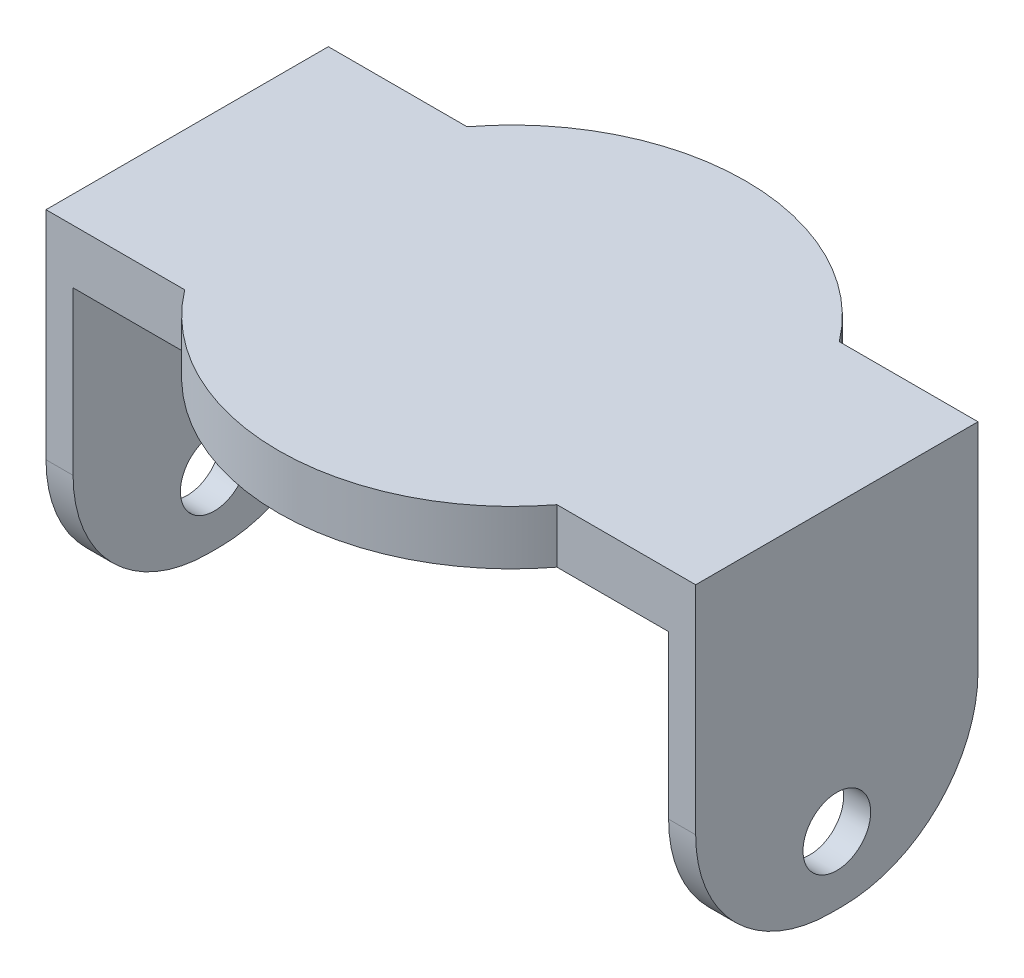
ISO-10303-21;
HEADER;
FILE_DESCRIPTION(('STEP AP214'),'2;1');
FILE_NAME('part.step','',(''),(''),'','','');
FILE_SCHEMA(('AUTOMOTIVE_DESIGN { 1 0 10303 214 1 1 1 1 }'));
ENDSEC;
DATA;
#1=APPLICATION_CONTEXT('core data for automotive mechanical design processes');
#2=APPLICATION_PROTOCOL_DEFINITION('international standard','automotive_design',2000,#1);
#3=PRODUCT_CONTEXT('',#1,'mechanical');
#4=PRODUCT('Part','Part','',(#3));
#5=PRODUCT_RELATED_PRODUCT_CATEGORY('part','',(#4));
#6=PRODUCT_DEFINITION_FORMATION('','',#4);
#7=PRODUCT_DEFINITION_CONTEXT('part definition',#1,'design');
#8=PRODUCT_DEFINITION('design','',#6,#7);
#9=PRODUCT_DEFINITION_SHAPE('','',#8);
#10=(LENGTH_UNIT() NAMED_UNIT(*) SI_UNIT(.MILLI.,.METRE.));
#11=(NAMED_UNIT(*) PLANE_ANGLE_UNIT() SI_UNIT($,.RADIAN.));
#12=(NAMED_UNIT(*) SI_UNIT($,.STERADIAN.) SOLID_ANGLE_UNIT());
#13=UNCERTAINTY_MEASURE_WITH_UNIT(LENGTH_MEASURE(1.E-05),#10,'distance_accuracy_value','');
#14=(GEOMETRIC_REPRESENTATION_CONTEXT(3) GLOBAL_UNCERTAINTY_ASSIGNED_CONTEXT((#13)) GLOBAL_UNIT_ASSIGNED_CONTEXT((#10,
#11,#12)) REPRESENTATION_CONTEXT('',''));
#15=CARTESIAN_POINT('',(0.,0.,0.));
#16=DIRECTION('',(0.,0.,1.));
#17=DIRECTION('',(1.,0.,0.));
#18=AXIS2_PLACEMENT_3D('',#15,#16,#17);
#19=CARTESIAN_POINT('',(0.,-26.,0.));
#20=DIRECTION('',(0.,1.,0.));
#21=DIRECTION('',(0.,0.,1.));
#22=AXIS2_PLACEMENT_3D('',#19,#20,#21);
#23=PLANE('',#22);
#24=DIRECTION('',(0.,0.,1.));
#25=VECTOR('',#24,1.);
#26=CARTESIAN_POINT('',(-22.,-26.,-23.));
#27=LINE('',#26,#25);
#28=CARTESIAN_POINT('',(-22.,-26.,-0.429999999999993));
#29=VERTEX_POINT('',#28);
#30=CARTESIAN_POINT('',(-22.,-26.,0.430000000000007));
#31=VERTEX_POINT('',#30);
#32=EDGE_CURVE('E206',#29,#31,#27,.T.);
#33=ORIENTED_EDGE('',*,*,#32,.T.);
#34=DIRECTION('',(1.,0.,0.));
#35=VECTOR('',#34,1.);
#36=CARTESIAN_POINT('',(0.,-26.,0.430000000000006));
#37=LINE('',#36,#35);
#38=CARTESIAN_POINT('',(-24.,-26.,0.430000000000007));
#39=VERTEX_POINT('',#38);
#40=EDGE_CURVE('E63',#31,#39,#37,.F.);
#41=ORIENTED_EDGE('',*,*,#40,.T.);
#42=DIRECTION('',(0.,0.,1.));
#43=VECTOR('',#42,1.);
#44=CARTESIAN_POINT('',(-24.,-26.,-23.));
#45=LINE('',#44,#43);
#46=CARTESIAN_POINT('',(-24.,-26.,-0.429999999999993));
#47=VERTEX_POINT('',#46);
#48=EDGE_CURVE('E221',#47,#39,#45,.T.);
#49=ORIENTED_EDGE('',*,*,#48,.F.);
#50=DIRECTION('',(1.,0.,0.));
#51=VECTOR('',#50,1.);
#52=CARTESIAN_POINT('',(0.,-26.,-0.429999999999995));
#53=LINE('',#52,#51);
#54=EDGE_CURVE('E257',#47,#29,#53,.T.);
#55=ORIENTED_EDGE('',*,*,#54,.T.);
#56=EDGE_LOOP('',(#33,#41,#49,#55));
#57=FACE_BOUND('',#56,.T.);
#58=ADVANCED_FACE('F41',(#57),#23,.F.);
#59=CARTESIAN_POINT('',(24.,-26.,-23.));
#60=DIRECTION('',(1.,0.,0.));
#61=DIRECTION('',(0.,0.,-1.));
#62=AXIS2_PLACEMENT_3D('',#59,#60,#61);
#63=PLANE('',#62);
#64=CARTESIAN_POINT('',(24.,-21.,0.));
#65=DIRECTION('',(1.,0.,0.));
#66=DIRECTION('',(0.,0.,-1.));
#67=AXIS2_PLACEMENT_3D('',#64,#65,#66);
#68=CIRCLE('',#67,2.5);
#69=CARTESIAN_POINT('',(24.,-21.,-2.5));
#70=VERTEX_POINT('',#69);
#71=EDGE_CURVE('E294',#70,#70,#68,.T.);
#72=ORIENTED_EDGE('',*,*,#71,.F.);
#73=EDGE_LOOP('',(#72));
#74=FACE_BOUND('',#73,.T.);
#75=DIRECTION('',(0.,0.,-1.));
#76=VECTOR('',#75,1.);
#77=CARTESIAN_POINT('',(24.,0.,-23.));
#78=LINE('',#77,#76);
#79=CARTESIAN_POINT('',(24.,0.,10.43));
#80=VERTEX_POINT('',#79);
#81=CARTESIAN_POINT('',(24.,0.,-10.43));
#82=VERTEX_POINT('',#81);
#83=EDGE_CURVE('E210',#80,#82,#78,.T.);
#84=ORIENTED_EDGE('',*,*,#83,.F.);
#85=DIRECTION('',(0.,1.,0.));
#86=VECTOR('',#85,1.);
#87=CARTESIAN_POINT('',(24.,-4.,10.43));
#88=LINE('',#87,#86);
#89=CARTESIAN_POINT('',(24.,-16.,10.43));
#90=VERTEX_POINT('',#89);
#91=EDGE_CURVE('E197',#90,#80,#88,.T.);
#92=ORIENTED_EDGE('',*,*,#91,.F.);
#93=CARTESIAN_POINT('',(24.,-16.,0.430000000000004));
#94=DIRECTION('',(1.,0.,0.));
#95=DIRECTION('',(0.,0.,-1.));
#96=AXIS2_PLACEMENT_3D('',#93,#94,#95);
#97=CIRCLE('',#96,10.);
#98=CARTESIAN_POINT('',(24.,-26.,0.430000000000003));
#99=VERTEX_POINT('',#98);
#100=EDGE_CURVE('E237',#90,#99,#97,.T.);
#101=ORIENTED_EDGE('',*,*,#100,.T.);
#102=DIRECTION('',(0.,0.,-1.));
#103=VECTOR('',#102,1.);
#104=CARTESIAN_POINT('',(24.,-26.,-23.));
#105=LINE('',#104,#103);
#106=CARTESIAN_POINT('',(24.,-26.,-0.429999999999996));
#107=VERTEX_POINT('',#106);
#108=EDGE_CURVE('E218',#99,#107,#105,.T.);
#109=ORIENTED_EDGE('',*,*,#108,.T.);
#110=CARTESIAN_POINT('',(24.,-16.,-0.429999999999996));
#111=DIRECTION('',(1.,0.,0.));
#112=DIRECTION('',(0.,0.,-1.));
#113=AXIS2_PLACEMENT_3D('',#110,#111,#112);
#114=CIRCLE('',#113,10.);
#115=CARTESIAN_POINT('',(24.,-16.,-10.43));
#116=VERTEX_POINT('',#115);
#117=EDGE_CURVE('E239',#107,#116,#114,.T.);
#118=ORIENTED_EDGE('',*,*,#117,.T.);
#119=DIRECTION('',(0.,-1.,0.));
#120=VECTOR('',#119,1.);
#121=CARTESIAN_POINT('',(24.,-4.,-10.43));
#122=LINE('',#121,#120);
#123=EDGE_CURVE('E182',#82,#116,#122,.T.);
#124=ORIENTED_EDGE('',*,*,#123,.F.);
#125=EDGE_LOOP('',(#84,#92,#101,#109,#118,#124));
#126=FACE_BOUND('',#125,.T.);
#127=ADVANCED_FACE('F342',(#74,#126),#63,.T.);
#128=CARTESIAN_POINT('',(-24.,-26.,-23.));
#129=DIRECTION('',(-1.,0.,0.));
#130=DIRECTION('',(0.,0.,1.));
#131=AXIS2_PLACEMENT_3D('',#128,#129,#130);
#132=PLANE('',#131);
#133=CARTESIAN_POINT('',(-24.,-21.,0.));
#134=DIRECTION('',(-1.,0.,0.));
#135=DIRECTION('',(0.,0.,1.));
#136=AXIS2_PLACEMENT_3D('',#133,#134,#135);
#137=CIRCLE('',#136,2.5);
#138=CARTESIAN_POINT('',(-24.,-21.,2.5));
#139=VERTEX_POINT('',#138);
#140=EDGE_CURVE('E319',#139,#139,#137,.T.);
#141=ORIENTED_EDGE('',*,*,#140,.F.);
#142=EDGE_LOOP('',(#141));
#143=FACE_BOUND('',#142,.T.);
#144=DIRECTION('',(0.,0.,1.));
#145=VECTOR('',#144,1.);
#146=CARTESIAN_POINT('',(-24.,0.,-23.));
#147=LINE('',#146,#145);
#148=CARTESIAN_POINT('',(-24.,0.,-10.43));
#149=VERTEX_POINT('',#148);
#150=CARTESIAN_POINT('',(-24.,0.,10.43));
#151=VERTEX_POINT('',#150);
#152=EDGE_CURVE('E222',#149,#151,#147,.T.);
#153=ORIENTED_EDGE('',*,*,#152,.F.);
#154=DIRECTION('',(0.,-1.,0.));
#155=VECTOR('',#154,1.);
#156=CARTESIAN_POINT('',(-24.,-4.,-10.43));
#157=LINE('',#156,#155);
#158=CARTESIAN_POINT('',(-24.,-16.,-10.43));
#159=VERTEX_POINT('',#158);
#160=EDGE_CURVE('E180',#149,#159,#157,.T.);
#161=ORIENTED_EDGE('',*,*,#160,.T.);
#162=CARTESIAN_POINT('',(-24.,-16.,-0.429999999999993));
#163=DIRECTION('',(-1.,0.,0.));
#164=DIRECTION('',(0.,0.,1.));
#165=AXIS2_PLACEMENT_3D('',#162,#163,#164);
#166=CIRCLE('',#165,10.);
#167=EDGE_CURVE('E261',#159,#47,#166,.T.);
#168=ORIENTED_EDGE('',*,*,#167,.T.);
#169=ORIENTED_EDGE('',*,*,#48,.T.);
#170=CARTESIAN_POINT('',(-24.,-16.,0.430000000000008));
#171=DIRECTION('',(-1.,0.,0.));
#172=DIRECTION('',(0.,0.,1.));
#173=AXIS2_PLACEMENT_3D('',#170,#171,#172);
#174=CIRCLE('',#173,10.);
#175=CARTESIAN_POINT('',(-24.,-16.,10.43));
#176=VERTEX_POINT('',#175);
#177=EDGE_CURVE('E50',#39,#176,#174,.T.);
#178=ORIENTED_EDGE('',*,*,#177,.T.);
#179=DIRECTION('',(0.,1.,0.));
#180=VECTOR('',#179,1.);
#181=CARTESIAN_POINT('',(-24.,-4.,10.43));
#182=LINE('',#181,#180);
#183=EDGE_CURVE('E194',#176,#151,#182,.T.);
#184=ORIENTED_EDGE('',*,*,#183,.T.);
#185=EDGE_LOOP('',(#153,#161,#168,#169,#178,#184));
#186=FACE_BOUND('',#185,.T.);
#187=ADVANCED_FACE('F266',(#143,#186),#132,.T.);
#188=DIRECTION('',(0.,0.,1.));
#189=VECTOR('',#188,1.);
#190=CARTESIAN_POINT('',(22.,-26.,-23.));
#191=LINE('',#190,#189);
#192=CARTESIAN_POINT('',(22.,-26.,-0.429999999999996));
#193=VERTEX_POINT('',#192);
#194=CARTESIAN_POINT('',(22.,-26.,0.430000000000003));
#195=VERTEX_POINT('',#194);
#196=EDGE_CURVE('E214',#193,#195,#191,.T.);
#197=ORIENTED_EDGE('',*,*,#196,.F.);
#198=DIRECTION('',(1.,0.,0.));
#199=VECTOR('',#198,1.);
#200=CARTESIAN_POINT('',(0.,-26.,-0.429999999999995));
#201=LINE('',#200,#199);
#202=EDGE_CURVE('E234',#193,#107,#201,.T.);
#203=ORIENTED_EDGE('',*,*,#202,.T.);
#204=ORIENTED_EDGE('',*,*,#108,.F.);
#205=DIRECTION('',(1.,0.,0.));
#206=VECTOR('',#205,1.);
#207=CARTESIAN_POINT('',(0.,-26.,0.430000000000006));
#208=LINE('',#207,#206);
#209=EDGE_CURVE('E232',#99,#195,#208,.F.);
#210=ORIENTED_EDGE('',*,*,#209,.T.);
#211=EDGE_LOOP('',(#197,#203,#204,#210));
#212=FACE_BOUND('',#211,.T.);
#213=ADVANCED_FACE('F344',(#212),#23,.F.);
#214=CARTESIAN_POINT('',(0.,0.,0.));
#215=DIRECTION('',(0.,1.,0.));
#216=DIRECTION('',(0.,0.,1.));
#217=AXIS2_PLACEMENT_3D('',#214,#215,#216);
#218=PLANE('',#217);
#219=CARTESIAN_POINT('',(0.,0.,0.));
#220=DIRECTION('',(0.,-1.,0.));
#221=DIRECTION('',(0.,0.,-1.));
#222=AXIS2_PLACEMENT_3D('',#219,#220,#221);
#223=CIRCLE('',#222,17.25825599532);
#224=CARTESIAN_POINT('',(-13.75,0.,-10.43));
#225=VERTEX_POINT('',#224);
#226=CARTESIAN_POINT('',(13.75,0.,-10.43));
#227=VERTEX_POINT('',#226);
#228=EDGE_CURVE('E158',#225,#227,#223,.T.);
#229=ORIENTED_EDGE('',*,*,#228,.F.);
#230=DIRECTION('',(-1.,0.,0.));
#231=VECTOR('',#230,1.);
#232=CARTESIAN_POINT('',(-13.75,0.,-10.43));
#233=LINE('',#232,#231);
#234=EDGE_CURVE('E172',#225,#149,#233,.T.);
#235=ORIENTED_EDGE('',*,*,#234,.T.);
#236=ORIENTED_EDGE('',*,*,#152,.T.);
#237=DIRECTION('',(-1.,0.,0.));
#238=VECTOR('',#237,1.);
#239=CARTESIAN_POINT('',(-13.75,0.,10.43));
#240=LINE('',#239,#238);
#241=CARTESIAN_POINT('',(-13.75,0.,10.43));
#242=VERTEX_POINT('',#241);
#243=EDGE_CURVE('E189',#242,#151,#240,.T.);
#244=ORIENTED_EDGE('',*,*,#243,.F.);
#245=CARTESIAN_POINT('',(0.,0.,0.));
#246=DIRECTION('',(0.,-1.,0.));
#247=DIRECTION('',(0.,0.,1.));
#248=AXIS2_PLACEMENT_3D('',#245,#246,#247);
#249=CIRCLE('',#248,17.25825599532);
#250=CARTESIAN_POINT('',(13.75,0.,10.43));
#251=VERTEX_POINT('',#250);
#252=EDGE_CURVE('E177',#251,#242,#249,.T.);
#253=ORIENTED_EDGE('',*,*,#252,.F.);
#254=DIRECTION('',(1.,0.,0.));
#255=VECTOR('',#254,1.);
#256=CARTESIAN_POINT('',(13.75,0.,10.43));
#257=LINE('',#256,#255);
#258=EDGE_CURVE('E192',#251,#80,#257,.T.);
#259=ORIENTED_EDGE('',*,*,#258,.T.);
#260=ORIENTED_EDGE('',*,*,#83,.T.);
#261=DIRECTION('',(1.,0.,0.));
#262=VECTOR('',#261,1.);
#263=CARTESIAN_POINT('',(13.75,0.,-10.43));
#264=LINE('',#263,#262);
#265=EDGE_CURVE('E176',#227,#82,#264,.T.);
#266=ORIENTED_EDGE('',*,*,#265,.F.);
#267=EDGE_LOOP('',(#229,#235,#236,#244,#253,#259,#260,#266));
#268=FACE_BOUND('',#267,.T.);
#269=ADVANCED_FACE('F170',(#268),#218,.T.);
#270=CARTESIAN_POINT('',(-22.,-26.,-23.));
#271=DIRECTION('',(-1.,0.,0.));
#272=DIRECTION('',(0.,0.,1.));
#273=AXIS2_PLACEMENT_3D('',#270,#271,#272);
#274=PLANE('',#273);
#275=CARTESIAN_POINT('',(-22.,-21.,0.));
#276=DIRECTION('',(-1.,0.,0.));
#277=DIRECTION('',(0.,0.,1.));
#278=AXIS2_PLACEMENT_3D('',#275,#276,#277);
#279=CIRCLE('',#278,2.5);
#280=CARTESIAN_POINT('',(-22.,-21.,2.5));
#281=VERTEX_POINT('',#280);
#282=EDGE_CURVE('E316',#281,#281,#279,.T.);
#283=ORIENTED_EDGE('',*,*,#282,.T.);
#284=EDGE_LOOP('',(#283));
#285=FACE_BOUND('',#284,.T.);
#286=DIRECTION('',(0.,-1.,0.));
#287=VECTOR('',#286,1.);
#288=CARTESIAN_POINT('',(-22.,-26.,10.43));
#289=LINE('',#288,#287);
#290=CARTESIAN_POINT('',(-22.,-4.,10.43));
#291=VERTEX_POINT('',#290);
#292=CARTESIAN_POINT('',(-22.,-16.,10.43));
#293=VERTEX_POINT('',#292);
#294=EDGE_CURVE('E203',#291,#293,#289,.T.);
#295=ORIENTED_EDGE('',*,*,#294,.T.);
#296=CARTESIAN_POINT('',(-22.,-16.,0.430000000000007));
#297=DIRECTION('',(-1.,0.,0.));
#298=DIRECTION('',(0.,0.,1.));
#299=AXIS2_PLACEMENT_3D('',#296,#297,#298);
#300=CIRCLE('',#299,10.);
#301=EDGE_CURVE('E255',#293,#31,#300,.F.);
#302=ORIENTED_EDGE('',*,*,#301,.T.);
#303=ORIENTED_EDGE('',*,*,#32,.F.);
#304=CARTESIAN_POINT('',(-22.,-16.,-0.429999999999993));
#305=DIRECTION('',(-1.,0.,0.));
#306=DIRECTION('',(0.,0.,1.));
#307=AXIS2_PLACEMENT_3D('',#304,#305,#306);
#308=CIRCLE('',#307,10.);
#309=CARTESIAN_POINT('',(-22.,-16.,-10.43));
#310=VERTEX_POINT('',#309);
#311=EDGE_CURVE('E253',#29,#310,#308,.F.);
#312=ORIENTED_EDGE('',*,*,#311,.T.);
#313=DIRECTION('',(0.,1.,0.));
#314=VECTOR('',#313,1.);
#315=CARTESIAN_POINT('',(-22.,-26.,-10.43));
#316=LINE('',#315,#314);
#317=CARTESIAN_POINT('',(-22.,-4.,-10.43));
#318=VERTEX_POINT('',#317);
#319=EDGE_CURVE('E196',#310,#318,#316,.T.);
#320=ORIENTED_EDGE('',*,*,#319,.T.);
#321=DIRECTION('',(0.,0.,1.));
#322=VECTOR('',#321,1.);
#323=CARTESIAN_POINT('',(-22.,-4.,-23.));
#324=LINE('',#323,#322);
#325=EDGE_CURVE('E207',#318,#291,#324,.T.);
#326=ORIENTED_EDGE('',*,*,#325,.T.);
#327=EDGE_LOOP('',(#295,#302,#303,#312,#320,#326));
#328=FACE_BOUND('',#327,.T.);
#329=ADVANCED_FACE('F277',(#285,#328),#274,.F.);
#330=CARTESIAN_POINT('',(-22.,-4.,-23.));
#331=DIRECTION('',(0.,1.,0.));
#332=DIRECTION('',(0.,0.,1.));
#333=AXIS2_PLACEMENT_3D('',#330,#331,#332);
#334=PLANE('',#333);
#335=DIRECTION('',(-1.,0.,0.));
#336=VECTOR('',#335,1.);
#337=CARTESIAN_POINT('',(-13.75,-4.,-10.43));
#338=LINE('',#337,#336);
#339=CARTESIAN_POINT('',(-13.75,-4.,-10.43));
#340=VERTEX_POINT('',#339);
#341=EDGE_CURVE('E164',#340,#318,#338,.T.);
#342=ORIENTED_EDGE('',*,*,#341,.F.);
#343=CARTESIAN_POINT('',(0.,-4.,0.));
#344=DIRECTION('',(0.,1.,0.));
#345=DIRECTION('',(0.,0.,1.));
#346=AXIS2_PLACEMENT_3D('',#343,#344,#345);
#347=CIRCLE('',#346,17.25825599532);
#348=CARTESIAN_POINT('',(13.75,-4.,-10.43));
#349=VERTEX_POINT('',#348);
#350=EDGE_CURVE('E161',#340,#349,#347,.F.);
#351=ORIENTED_EDGE('',*,*,#350,.T.);
#352=DIRECTION('',(1.,0.,0.));
#353=VECTOR('',#352,1.);
#354=CARTESIAN_POINT('',(13.75,-4.,-10.43));
#355=LINE('',#354,#353);
#356=CARTESIAN_POINT('',(22.,-4.,-10.43));
#357=VERTEX_POINT('',#356);
#358=EDGE_CURVE('E308',#349,#357,#355,.T.);
#359=ORIENTED_EDGE('',*,*,#358,.T.);
#360=DIRECTION('',(0.,0.,1.));
#361=VECTOR('',#360,1.);
#362=CARTESIAN_POINT('',(22.,-4.,-23.));
#363=LINE('',#362,#361);
#364=CARTESIAN_POINT('',(22.,-4.,10.43));
#365=VERTEX_POINT('',#364);
#366=EDGE_CURVE('E211',#357,#365,#363,.T.);
#367=ORIENTED_EDGE('',*,*,#366,.T.);
#368=DIRECTION('',(1.,0.,0.));
#369=VECTOR('',#368,1.);
#370=CARTESIAN_POINT('',(13.75,-4.,10.43));
#371=LINE('',#370,#369);
#372=CARTESIAN_POINT('',(13.75,-4.,10.43));
#373=VERTEX_POINT('',#372);
#374=EDGE_CURVE('E302',#373,#365,#371,.T.);
#375=ORIENTED_EDGE('',*,*,#374,.F.);
#376=CARTESIAN_POINT('',(0.,-4.,0.));
#377=DIRECTION('',(0.,1.,0.));
#378=DIRECTION('',(0.,0.,1.));
#379=AXIS2_PLACEMENT_3D('',#376,#377,#378);
#380=CIRCLE('',#379,17.25825599532);
#381=CARTESIAN_POINT('',(-13.75,-4.,10.43));
#382=VERTEX_POINT('',#381);
#383=EDGE_CURVE('E288',#373,#382,#380,.F.);
#384=ORIENTED_EDGE('',*,*,#383,.T.);
#385=DIRECTION('',(-1.,0.,0.));
#386=VECTOR('',#385,1.);
#387=CARTESIAN_POINT('',(-13.75,-4.,10.43));
#388=LINE('',#387,#386);
#389=EDGE_CURVE('E187',#382,#291,#388,.T.);
#390=ORIENTED_EDGE('',*,*,#389,.T.);
#391=ORIENTED_EDGE('',*,*,#325,.F.);
#392=EDGE_LOOP('',(#342,#351,#359,#367,#375,#384,#390,#391));
#393=FACE_BOUND('',#392,.T.);
#394=ADVANCED_FACE('F283',(#393),#334,.F.);
#395=CARTESIAN_POINT('',(22.,-26.,-23.));
#396=DIRECTION('',(1.,0.,0.));
#397=DIRECTION('',(0.,0.,-1.));
#398=AXIS2_PLACEMENT_3D('',#395,#396,#397);
#399=PLANE('',#398);
#400=CARTESIAN_POINT('',(22.,-21.,0.));
#401=DIRECTION('',(1.,0.,0.));
#402=DIRECTION('',(0.,0.,-1.));
#403=AXIS2_PLACEMENT_3D('',#400,#401,#402);
#404=CIRCLE('',#403,2.5);
#405=CARTESIAN_POINT('',(22.,-21.,-2.5));
#406=VERTEX_POINT('',#405);
#407=EDGE_CURVE('E45',#406,#406,#404,.T.);
#408=ORIENTED_EDGE('',*,*,#407,.T.);
#409=EDGE_LOOP('',(#408));
#410=FACE_BOUND('',#409,.T.);
#411=DIRECTION('',(0.,-1.,0.));
#412=VECTOR('',#411,1.);
#413=CARTESIAN_POINT('',(22.,-26.,-10.43));
#414=LINE('',#413,#412);
#415=CARTESIAN_POINT('',(22.,-16.,-10.43));
#416=VERTEX_POINT('',#415);
#417=EDGE_CURVE('E224',#357,#416,#414,.T.);
#418=ORIENTED_EDGE('',*,*,#417,.T.);
#419=CARTESIAN_POINT('',(22.,-16.,-0.429999999999996));
#420=DIRECTION('',(1.,0.,0.));
#421=DIRECTION('',(0.,0.,-1.));
#422=AXIS2_PLACEMENT_3D('',#419,#420,#421);
#423=CIRCLE('',#422,10.);
#424=EDGE_CURVE('E245',#416,#193,#423,.F.);
#425=ORIENTED_EDGE('',*,*,#424,.T.);
#426=ORIENTED_EDGE('',*,*,#196,.T.);
#427=CARTESIAN_POINT('',(22.,-16.,0.430000000000004));
#428=DIRECTION('',(1.,0.,0.));
#429=DIRECTION('',(0.,0.,-1.));
#430=AXIS2_PLACEMENT_3D('',#427,#428,#429);
#431=CIRCLE('',#430,10.);
#432=CARTESIAN_POINT('',(22.,-16.,10.43));
#433=VERTEX_POINT('',#432);
#434=EDGE_CURVE('E243',#195,#433,#431,.F.);
#435=ORIENTED_EDGE('',*,*,#434,.T.);
#436=DIRECTION('',(0.,1.,0.));
#437=VECTOR('',#436,1.);
#438=CARTESIAN_POINT('',(22.,-26.,10.43));
#439=LINE('',#438,#437);
#440=EDGE_CURVE('E229',#433,#365,#439,.T.);
#441=ORIENTED_EDGE('',*,*,#440,.T.);
#442=ORIENTED_EDGE('',*,*,#366,.F.);
#443=EDGE_LOOP('',(#418,#425,#426,#435,#441,#442));
#444=FACE_BOUND('',#443,.T.);
#445=ADVANCED_FACE('F326',(#410,#444),#399,.F.);
#446=CARTESIAN_POINT('',(-24.,-4.,-10.43));
#447=DIRECTION('',(0.,0.,1.));
#448=DIRECTION('',(1.,0.,0.));
#449=AXIS2_PLACEMENT_3D('',#446,#447,#448);
#450=PLANE('',#449);
#451=ORIENTED_EDGE('',*,*,#123,.T.);
#452=DIRECTION('',(1.,0.,0.));
#453=VECTOR('',#452,1.);
#454=CARTESIAN_POINT('',(-24.,-16.,-10.43));
#455=LINE('',#454,#453);
#456=EDGE_CURVE('E241',#116,#416,#455,.F.);
#457=ORIENTED_EDGE('',*,*,#456,.T.);
#458=ORIENTED_EDGE('',*,*,#417,.F.);
#459=ORIENTED_EDGE('',*,*,#358,.F.);
#460=DIRECTION('',(0.,-1.,0.));
#461=VECTOR('',#460,1.);
#462=CARTESIAN_POINT('',(13.75,-4.,-10.43));
#463=LINE('',#462,#461);
#464=EDGE_CURVE('E310',#227,#349,#463,.T.);
#465=ORIENTED_EDGE('',*,*,#464,.F.);
#466=ORIENTED_EDGE('',*,*,#265,.T.);
#467=EDGE_LOOP('',(#451,#457,#458,#459,#465,#466));
#468=FACE_BOUND('',#467,.T.);
#469=ADVANCED_FACE('F374',(#468),#450,.F.);
#470=CARTESIAN_POINT('',(-24.,-4.,10.43));
#471=DIRECTION('',(0.,0.,-1.));
#472=DIRECTION('',(0.,1.,0.));
#473=AXIS2_PLACEMENT_3D('',#470,#471,#472);
#474=PLANE('',#473);
#475=ORIENTED_EDGE('',*,*,#440,.F.);
#476=DIRECTION('',(1.,0.,0.));
#477=VECTOR('',#476,1.);
#478=CARTESIAN_POINT('',(-24.,-16.,10.43));
#479=LINE('',#478,#477);
#480=EDGE_CURVE('E247',#433,#90,#479,.T.);
#481=ORIENTED_EDGE('',*,*,#480,.T.);
#482=ORIENTED_EDGE('',*,*,#91,.T.);
#483=ORIENTED_EDGE('',*,*,#258,.F.);
#484=DIRECTION('',(0.,1.,0.));
#485=VECTOR('',#484,1.);
#486=CARTESIAN_POINT('',(13.75,0.,10.43));
#487=LINE('',#486,#485);
#488=EDGE_CURVE('E300',#373,#251,#487,.T.);
#489=ORIENTED_EDGE('',*,*,#488,.F.);
#490=ORIENTED_EDGE('',*,*,#374,.T.);
#491=EDGE_LOOP('',(#475,#481,#482,#483,#489,#490));
#492=FACE_BOUND('',#491,.T.);
#493=ADVANCED_FACE('F299',(#492),#474,.F.);
#494=ORIENTED_EDGE('',*,*,#319,.F.);
#495=DIRECTION('',(1.,0.,0.));
#496=VECTOR('',#495,1.);
#497=CARTESIAN_POINT('',(-24.,-16.,-10.43));
#498=LINE('',#497,#496);
#499=EDGE_CURVE('E11',#310,#159,#498,.F.);
#500=ORIENTED_EDGE('',*,*,#499,.T.);
#501=ORIENTED_EDGE('',*,*,#160,.F.);
#502=ORIENTED_EDGE('',*,*,#234,.F.);
#503=DIRECTION('',(0.,1.,0.));
#504=VECTOR('',#503,1.);
#505=CARTESIAN_POINT('',(-13.75,0.,-10.43));
#506=LINE('',#505,#504);
#507=EDGE_CURVE('E155',#340,#225,#506,.T.);
#508=ORIENTED_EDGE('',*,*,#507,.F.);
#509=ORIENTED_EDGE('',*,*,#341,.T.);
#510=EDGE_LOOP('',(#494,#500,#501,#502,#508,#509));
#511=FACE_BOUND('',#510,.T.);
#512=ADVANCED_FACE('F179',(#511),#450,.F.);
#513=ORIENTED_EDGE('',*,*,#183,.F.);
#514=DIRECTION('',(1.,0.,0.));
#515=VECTOR('',#514,1.);
#516=CARTESIAN_POINT('',(-24.,-16.,10.43));
#517=LINE('',#516,#515);
#518=EDGE_CURVE('E250',#176,#293,#517,.T.);
#519=ORIENTED_EDGE('',*,*,#518,.T.);
#520=ORIENTED_EDGE('',*,*,#294,.F.);
#521=ORIENTED_EDGE('',*,*,#389,.F.);
#522=DIRECTION('',(0.,-1.,0.));
#523=VECTOR('',#522,1.);
#524=CARTESIAN_POINT('',(-13.75,-4.,10.43));
#525=LINE('',#524,#523);
#526=EDGE_CURVE('E165',#242,#382,#525,.T.);
#527=ORIENTED_EDGE('',*,*,#526,.F.);
#528=ORIENTED_EDGE('',*,*,#243,.T.);
#529=EDGE_LOOP('',(#513,#519,#520,#521,#527,#528));
#530=FACE_BOUND('',#529,.T.);
#531=ADVANCED_FACE('F270',(#530),#474,.F.);
#532=CARTESIAN_POINT('',(0.,-16.,-0.429999999999995));
#533=DIRECTION('',(1.,0.,0.));
#534=DIRECTION('',(0.,0.,-1.));
#535=AXIS2_PLACEMENT_3D('',#532,#533,#534);
#536=CYLINDRICAL_SURFACE('',#535,10.);
#537=ORIENTED_EDGE('',*,*,#424,.F.);
#538=ORIENTED_EDGE('',*,*,#456,.F.);
#539=ORIENTED_EDGE('',*,*,#117,.F.);
#540=ORIENTED_EDGE('',*,*,#202,.F.);
#541=EDGE_LOOP('',(#537,#538,#539,#540));
#542=FACE_BOUND('',#541,.T.);
#543=ADVANCED_FACE('F370',(#542),#536,.T.);
#544=CARTESIAN_POINT('',(-24.,-16.,0.430000000000008));
#545=DIRECTION('',(1.,0.,0.));
#546=DIRECTION('',(0.,0.,-1.));
#547=AXIS2_PLACEMENT_3D('',#544,#545,#546);
#548=CYLINDRICAL_SURFACE('',#547,10.);
#549=ORIENTED_EDGE('',*,*,#434,.F.);
#550=ORIENTED_EDGE('',*,*,#209,.F.);
#551=ORIENTED_EDGE('',*,*,#100,.F.);
#552=ORIENTED_EDGE('',*,*,#480,.F.);
#553=EDGE_LOOP('',(#549,#550,#551,#552));
#554=FACE_BOUND('',#553,.T.);
#555=ADVANCED_FACE('F378',(#554),#548,.T.);
#556=CARTESIAN_POINT('',(-24.,-16.,0.430000000000008));
#557=DIRECTION('',(1.,0.,0.));
#558=DIRECTION('',(0.,0.,-1.));
#559=AXIS2_PLACEMENT_3D('',#556,#557,#558);
#560=CYLINDRICAL_SURFACE('',#559,10.);
#561=ORIENTED_EDGE('',*,*,#177,.F.);
#562=ORIENTED_EDGE('',*,*,#40,.F.);
#563=ORIENTED_EDGE('',*,*,#301,.F.);
#564=ORIENTED_EDGE('',*,*,#518,.F.);
#565=EDGE_LOOP('',(#561,#562,#563,#564));
#566=FACE_BOUND('',#565,.T.);
#567=ADVANCED_FACE('F274',(#566),#560,.T.);
#568=CARTESIAN_POINT('',(0.,-16.,-0.429999999999995));
#569=DIRECTION('',(1.,0.,0.));
#570=DIRECTION('',(0.,0.,-1.));
#571=AXIS2_PLACEMENT_3D('',#568,#569,#570);
#572=CYLINDRICAL_SURFACE('',#571,10.);
#573=ORIENTED_EDGE('',*,*,#167,.F.);
#574=ORIENTED_EDGE('',*,*,#499,.F.);
#575=ORIENTED_EDGE('',*,*,#311,.F.);
#576=ORIENTED_EDGE('',*,*,#54,.F.);
#577=EDGE_LOOP('',(#573,#574,#575,#576));
#578=FACE_BOUND('',#577,.T.);
#579=ADVANCED_FACE('F43',(#578),#572,.T.);
#580=CARTESIAN_POINT('',(0.,-10.25,0.));
#581=DIRECTION('',(0.,1.,0.));
#582=DIRECTION('',(0.,0.,1.));
#583=AXIS2_PLACEMENT_3D('',#580,#581,#582);
#584=CYLINDRICAL_SURFACE('',#583,17.25825599532);
#585=ORIENTED_EDGE('',*,*,#507,.T.);
#586=ORIENTED_EDGE('',*,*,#228,.T.);
#587=ORIENTED_EDGE('',*,*,#464,.T.);
#588=ORIENTED_EDGE('',*,*,#350,.F.);
#589=EDGE_LOOP('',(#585,#586,#587,#588));
#590=FACE_BOUND('',#589,.T.);
#591=ADVANCED_FACE('F157',(#590),#584,.T.);
#592=CARTESIAN_POINT('',(0.,-10.25,0.));
#593=DIRECTION('',(0.,1.,0.));
#594=DIRECTION('',(0.,0.,1.));
#595=AXIS2_PLACEMENT_3D('',#592,#593,#594);
#596=CYLINDRICAL_SURFACE('',#595,17.25825599532);
#597=ORIENTED_EDGE('',*,*,#488,.T.);
#598=ORIENTED_EDGE('',*,*,#252,.T.);
#599=ORIENTED_EDGE('',*,*,#526,.T.);
#600=ORIENTED_EDGE('',*,*,#383,.F.);
#601=EDGE_LOOP('',(#597,#598,#599,#600));
#602=FACE_BOUND('',#601,.T.);
#603=ADVANCED_FACE('F311',(#602),#596,.T.);
#604=CARTESIAN_POINT('',(29.,-21.,0.));
#605=DIRECTION('',(-1.,0.,0.));
#606=DIRECTION('',(0.,0.,1.));
#607=AXIS2_PLACEMENT_3D('',#604,#605,#606);
#608=CYLINDRICAL_SURFACE('',#607,2.5);
#609=ORIENTED_EDGE('',*,*,#71,.T.);
#610=EDGE_LOOP('',(#609));
#611=FACE_BOUND('',#610,.T.);
#612=ORIENTED_EDGE('',*,*,#407,.F.);
#613=EDGE_LOOP('',(#612));
#614=FACE_BOUND('',#613,.T.);
#615=ADVANCED_FACE('F329',(#611,#614),#608,.F.);
#616=ORIENTED_EDGE('',*,*,#140,.T.);
#617=EDGE_LOOP('',(#616));
#618=FACE_BOUND('',#617,.T.);
#619=ORIENTED_EDGE('',*,*,#282,.F.);
#620=EDGE_LOOP('',(#619));
#621=FACE_BOUND('',#620,.T.);
#622=ADVANCED_FACE('F331',(#618,#621),#608,.F.);
#623=CLOSED_SHELL('',(#58,#127,#187,#213,#269,#329,#394,#445,#469,#493,#512,#531,#543,#555,#567,
#579,#591,#603,#615,#622));
#624=MANIFOLD_SOLID_BREP('B2',#623);
#625=ADVANCED_BREP_SHAPE_REPRESENTATION('',(#18,#624),#14);
#626=SHAPE_DEFINITION_REPRESENTATION(#9,#625);
ENDSEC;
END-ISO-10303-21;
